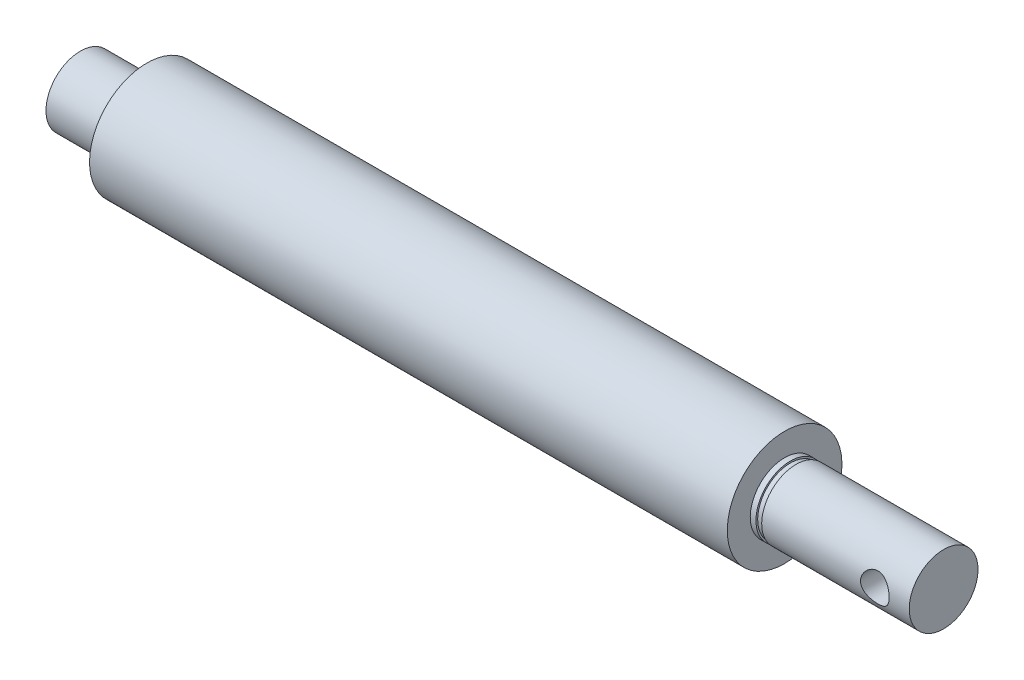
ISO-10303-21;
HEADER;
FILE_DESCRIPTION(('STEP AP214'),'2;1');
FILE_NAME('part.step','',(''),(''),'','','');
FILE_SCHEMA(('AUTOMOTIVE_DESIGN { 1 0 10303 214 1 1 1 1 }'));
ENDSEC;
DATA;
#1=APPLICATION_CONTEXT('core data for automotive mechanical design processes');
#2=APPLICATION_PROTOCOL_DEFINITION('international standard','automotive_design',2000,#1);
#3=PRODUCT_CONTEXT('',#1,'mechanical');
#4=PRODUCT('Part','Part','',(#3));
#5=PRODUCT_RELATED_PRODUCT_CATEGORY('part','',(#4));
#6=PRODUCT_DEFINITION_FORMATION('','',#4);
#7=PRODUCT_DEFINITION_CONTEXT('part definition',#1,'design');
#8=PRODUCT_DEFINITION('design','',#6,#7);
#9=PRODUCT_DEFINITION_SHAPE('','',#8);
#10=(LENGTH_UNIT() NAMED_UNIT(*) SI_UNIT(.MILLI.,.METRE.));
#11=(NAMED_UNIT(*) PLANE_ANGLE_UNIT() SI_UNIT($,.RADIAN.));
#12=(NAMED_UNIT(*) SI_UNIT($,.STERADIAN.) SOLID_ANGLE_UNIT());
#13=UNCERTAINTY_MEASURE_WITH_UNIT(LENGTH_MEASURE(1.E-05),#10,'distance_accuracy_value','');
#14=(GEOMETRIC_REPRESENTATION_CONTEXT(3) GLOBAL_UNCERTAINTY_ASSIGNED_CONTEXT((#13)) GLOBAL_UNIT_ASSIGNED_CONTEXT((#10,
#11,#12)) REPRESENTATION_CONTEXT('',''));
#15=CARTESIAN_POINT('',(0.,0.,0.));
#16=DIRECTION('',(0.,0.,1.));
#17=DIRECTION('',(1.,0.,0.));
#18=AXIS2_PLACEMENT_3D('',#15,#16,#17);
#19=CARTESIAN_POINT('',(0.,3.,0.));
#20=DIRECTION('',(1.,0.,0.));
#21=DIRECTION('',(0.,1.,0.));
#22=AXIS2_PLACEMENT_3D('',#19,#20,#21);
#23=PLANE('',#22);
#24=CARTESIAN_POINT('',(0.,0.,0.));
#25=DIRECTION('',(-1.,0.,0.));
#26=DIRECTION('',(0.,-1.,0.));
#27=AXIS2_PLACEMENT_3D('',#24,#25,#26);
#28=CIRCLE('',#27,3.);
#29=CARTESIAN_POINT('',(0.,-3.,0.));
#30=VERTEX_POINT('',#29);
#31=EDGE_CURVE('E135',#30,#30,#28,.T.);
#32=ORIENTED_EDGE('',*,*,#31,.T.);
#33=EDGE_LOOP('',(#32));
#34=FACE_BOUND('',#33,.T.);
#35=ADVANCED_FACE('F42',(#34),#23,.F.);
#36=CARTESIAN_POINT('',(75.3,0.,0.));
#37=DIRECTION('',(-1.,0.,0.));
#38=DIRECTION('',(0.,-1.,0.));
#39=AXIS2_PLACEMENT_3D('',#36,#37,#38);
#40=PLANE('',#39);
#41=CARTESIAN_POINT('',(75.3,0.,0.));
#42=DIRECTION('',(-1.,0.,0.));
#43=DIRECTION('',(0.,-1.,0.));
#44=AXIS2_PLACEMENT_3D('',#41,#42,#43);
#45=CIRCLE('',#44,3.00000000000001);
#46=CARTESIAN_POINT('',(75.3,-2.99999999999999,0.));
#47=VERTEX_POINT('',#46);
#48=EDGE_CURVE('E12',#47,#47,#45,.T.);
#49=ORIENTED_EDGE('',*,*,#48,.F.);
#50=EDGE_LOOP('',(#49));
#51=FACE_BOUND('',#50,.T.);
#52=ADVANCED_FACE('F123',(#51),#40,.F.);
#53=CARTESIAN_POINT('',(0.,0.,0.));
#54=DIRECTION('',(-1.,0.,0.));
#55=DIRECTION('',(0.,-1.,0.));
#56=AXIS2_PLACEMENT_3D('',#53,#54,#55);
#57=CYLINDRICAL_SURFACE('',#56,3.00000000000001);
#58=CARTESIAN_POINT('',(71.05,0.,3.00000000000001));
#59=CARTESIAN_POINT('',(71.0500072050913,0.0669580526362662,2.99999458367274));
#60=CARTESIAN_POINT('',(71.0554119585281,0.134021397063839,2.99773232974711));
#61=CARTESIAN_POINT('',(71.0768390649202,0.266247371156346,2.98890153579553));
#62=CARTESIAN_POINT('',(71.0928891244642,0.331404576423564,2.98232175901029));
#63=CARTESIAN_POINT('',(71.1349110917806,0.457688733653085,2.96556289038128));
#64=CARTESIAN_POINT('',(71.1608493894681,0.518828524426263,2.95539599975005));
#65=CARTESIAN_POINT('',(71.2217728232326,0.635829756679795,2.93245286470665));
#66=CARTESIAN_POINT('',(71.2567552189709,0.691692790015935,2.9196774109285));
#67=CARTESIAN_POINT('',(71.3366289825909,0.79944840355951,2.8920782835187));
#68=CARTESIAN_POINT('',(71.3819013087897,0.851041267517767,2.87718753326094));
#69=CARTESIAN_POINT('',(71.4802643347826,0.94615982109126,2.84732714068515));
#70=CARTESIAN_POINT('',(71.5333591248945,0.989681263153082,2.83235746106811));
#71=CARTESIAN_POINT('',(71.6490267775649,1.06953737697065,2.80321021812997));
#72=CARTESIAN_POINT('',(71.7119374484265,1.10541308153925,2.78910786873386));
#73=CARTESIAN_POINT('',(71.8435732579209,1.16593940588865,2.76435572357007));
#74=CARTESIAN_POINT('',(71.9122953794844,1.1905958083629,2.75370415000825));
#75=CARTESIAN_POINT('',(72.0501536917679,1.22674598312158,2.73778555387707));
#76=CARTESIAN_POINT('',(72.1191104833921,1.23881657877605,2.73228387651789));
#77=CARTESIAN_POINT('',(72.2582732926866,1.25125209967796,2.72661326219506));
#78=CARTESIAN_POINT('',(72.3284786000257,1.25162348054397,2.72644138425261));
#79=CARTESIAN_POINT('',(72.4624000604349,1.24108450363674,2.73125119560854));
#80=CARTESIAN_POINT('',(72.5262010965645,1.231036811123,2.73583882723625));
#81=CARTESIAN_POINT('',(72.6511120910004,1.20139191015776,2.74898482773798));
#82=CARTESIAN_POINT('',(72.7122215314918,1.18179287287176,2.75754395703565));
#83=CARTESIAN_POINT('',(72.8315577029914,1.13321958727571,2.77786184772758));
#84=CARTESIAN_POINT('',(72.8896954209134,1.10405471539236,2.78968481949138));
#85=CARTESIAN_POINT('',(73.0004777338801,1.03731242580562,2.81518331141087));
#86=CARTESIAN_POINT('',(73.0531201506135,0.999731690519542,2.82885956129781));
#87=CARTESIAN_POINT('',(73.1560999587328,0.913495965543835,2.85792976877981));
#88=CARTESIAN_POINT('',(73.2058665673854,0.864173483207527,2.87337121404474));
#89=CARTESIAN_POINT('',(73.2966135029592,0.757729591051513,2.90325673112531));
#90=CARTESIAN_POINT('',(73.3375917716922,0.700606359448457,2.91770056877011));
#91=CARTESIAN_POINT('',(73.4104358236163,0.578447948693374,2.94438283556474));
#92=CARTESIAN_POINT('',(73.4420694451507,0.513260582447676,2.95656266543335));
#93=CARTESIAN_POINT('',(73.4937211396033,0.377852402526825,2.97689481414804));
#94=CARTESIAN_POINT('',(73.5137456319438,0.307634394795027,2.98504935845801));
#95=CARTESIAN_POINT('',(73.5404159921266,0.16892811334622,2.99599641186386));
#96=CARTESIAN_POINT('',(73.5478278574437,0.100611285278633,2.99909541047126));
#97=CARTESIAN_POINT('',(73.5513462236141,-0.0363546554960932,3.00056050368746));
#98=CARTESIAN_POINT('',(73.547455970252,-0.105003667152638,2.9989279571194));
#99=CARTESIAN_POINT('',(73.5290289151939,-0.237098242341437,2.99131217656941));
#100=CARTESIAN_POINT('',(73.5150300459028,-0.300632966639388,2.9855488728399));
#101=CARTESIAN_POINT('',(73.4775318054592,-0.424382748971092,2.97048606772415));
#102=CARTESIAN_POINT('',(73.4540312340497,-0.484597386518362,2.96118611959704));
#103=CARTESIAN_POINT('',(73.3974290242879,-0.602108999869134,2.93958270645166));
#104=CARTESIAN_POINT('',(73.364051816854,-0.65925723685532,2.92719491469282));
#105=CARTESIAN_POINT('',(73.2889466222083,-0.767346216231424,2.90073804579091));
#106=CARTESIAN_POINT('',(73.2472151484707,-0.818284352601936,2.88666826768733));
#107=CARTESIAN_POINT('',(73.1530967667276,-0.916333430274259,2.85712087895438));
#108=CARTESIAN_POINT('',(73.1001614970137,-0.962910697979832,2.84161451591029));
#109=CARTESIAN_POINT('',(72.9869787240646,-1.04666984610551,2.81184336768005));
#110=CARTESIAN_POINT('',(72.9267295648283,-1.08384959285617,2.79757886493439));
#111=CARTESIAN_POINT('',(72.7993858246974,-1.14815960208699,2.77181386243988));
#112=CARTESIAN_POINT('',(72.7322059644851,-1.17513918237329,2.76035562555112));
#113=CARTESIAN_POINT('',(72.5936294061899,-1.21717413951573,2.74208355658957));
#114=CARTESIAN_POINT('',(72.5222362375166,-1.23223934863687,2.73526589555752));
#115=CARTESIAN_POINT('',(72.3831813008008,-1.24904080348901,2.72763164537264));
#116=CARTESIAN_POINT('',(72.3156553377074,-1.25171380413129,2.72639350967163));
#117=CARTESIAN_POINT('',(72.1811571388589,-1.24615575523912,2.72893853011024));
#118=CARTESIAN_POINT('',(72.1141848196863,-1.23792637964721,2.73272091540307));
#119=CARTESIAN_POINT('',(71.9859072525311,-1.21158404780491,2.74449551302268));
#120=CARTESIAN_POINT('',(71.9244833265366,-1.19394903571466,2.75228354846481));
#121=CARTESIAN_POINT('',(71.8054519786428,-1.14976328202134,2.77103181199189));
#122=CARTESIAN_POINT('',(71.7478456346012,-1.12321003517251,2.78199293131694));
#123=CARTESIAN_POINT('',(71.6343041040509,-1.06010285935489,2.80666954560014));
#124=CARTESIAN_POINT('',(71.5786776698317,-1.02304360910482,2.8205110271368));
#125=CARTESIAN_POINT('',(71.4741398606393,-0.940684072630383,2.8490368905384));
#126=CARTESIAN_POINT('',(71.4252308243994,-0.895380928905613,2.86372156345875));
#127=CARTESIAN_POINT('',(71.3318513183152,-0.793902045778817,2.89356392850107));
#128=CARTESIAN_POINT('',(71.2879635671593,-0.737174739949023,2.90867817511792));
#129=CARTESIAN_POINT('',(71.2103005464564,-0.616600079253196,2.93660143622021));
#130=CARTESIAN_POINT('',(71.1765298851104,-0.552749497945745,2.94940939916741));
#131=CARTESIAN_POINT('',(71.1207901545601,-0.420732056717952,2.97109183362461));
#132=CARTESIAN_POINT('',(71.0986352333827,-0.352653990980636,2.98002782581964));
#133=CARTESIAN_POINT('',(71.0662936709221,-0.213410421846556,2.99321009768625));
#134=CARTESIAN_POINT('',(71.0560695574701,-0.142255316980952,2.99747105811967));
#135=CARTESIAN_POINT('',(71.0506668389135,-0.047236081919179,2.99972287568934));
#136=CARTESIAN_POINT('',(71.0499974578508,-0.0236245946756549,3.00000191102537));
#137=CARTESIAN_POINT('',(71.05,0.,3.00000000000001));
#138=B_SPLINE_CURVE_WITH_KNOTS('',3,(#58,#59,#60,#61,#62,#63,#64,#65,#66,#67,#68,#69,#70,#71,
#72,#73,#74,#75,#76,#77,#78,#79,#80,#81,#82,#83,#84,#85,#86,#87,#88,#89,#90,#91,#92,#93,#94,#95,
#96,#97,#98,#99,#100,#101,#102,#103,#104,#105,#106,#107,#108,#109,#110,#111,#112,#113,#114,#115,
#116,#117,#118,#119,#120,#121,#122,#123,#124,#125,#126,#127,#128,#129,#130,#131,#132,#133,#134,
#135,#136,#137),.UNSPECIFIED.,.T.,.F.,(4,2,2,2,2,2,2,2,2,2,2,2,2,2,2,2,2,2,2,2,2,2,2,2,2,2,2,2,
2,2,2,2,2,2,2,2,2,2,2,4),(0.,0.200806918883938,0.402138540628695,0.602791851906291,
0.803384436852974,1.01317936288807,1.22308438131465,1.44331724539124,1.66343646730587,
1.87295273137556,2.08235338249046,2.27570157202557,2.46908679727213,2.66658713058715,
2.86416545717206,3.07844141127895,3.29276749314588,3.51204055060813,3.73119224218297,
3.93648443393251,4.14171767493171,4.33676589735721,4.53183876601785,4.7329713527216,
4.93418805469496,5.14978488029293,5.36543061240341,5.58414788359523,5.8026844707458,
6.00439877559643,6.20608211297537,6.39837649964763,6.59072494950613,6.79463893397441,
6.99862373425943,7.21746535004889,7.43640649428582,7.65172855819385,7.86637250469321,
7.93722256499097),.UNSPECIFIED.);
#139=CARTESIAN_POINT('',(71.05,0.,3.00000000000001));
#140=VERTEX_POINT('',#139);
#141=EDGE_CURVE('E45',#140,#140,#138,.T.);
#142=ORIENTED_EDGE('',*,*,#141,.T.);
#143=EDGE_LOOP('',(#142));
#144=FACE_BOUND('',#143,.T.);
#145=CARTESIAN_POINT('',(71.05,0.,-3.00000000000001));
#146=CARTESIAN_POINT('',(71.0500072050913,-0.0669580526362663,-2.99999458367273));
#147=CARTESIAN_POINT('',(71.0554119585281,-0.13402139706384,-2.99773232974711));
#148=CARTESIAN_POINT('',(71.0768390649202,-0.266247371156346,-2.98890153579552));
#149=CARTESIAN_POINT('',(71.0928891244642,-0.331404576423566,-2.98232175901028));
#150=CARTESIAN_POINT('',(71.1349110917806,-0.45768873365309,-2.96556289038128));
#151=CARTESIAN_POINT('',(71.1608493894682,-0.51882852442627,-2.95539599975004));
#152=CARTESIAN_POINT('',(71.2217728232326,-0.635829756679802,-2.93245286470664));
#153=CARTESIAN_POINT('',(71.2567552189709,-0.691692790015939,-2.9196774109285));
#154=CARTESIAN_POINT('',(71.3366289825909,-0.799448403559511,-2.89207828351869));
#155=CARTESIAN_POINT('',(71.3819013087897,-0.851041267517768,-2.87718753326093));
#156=CARTESIAN_POINT('',(71.4802643347826,-0.94615982109126,-2.84732714068514));
#157=CARTESIAN_POINT('',(71.5333591248945,-0.989681263153082,-2.8323574610681));
#158=CARTESIAN_POINT('',(71.6490267775649,-1.06953737697065,-2.80321021812995));
#159=CARTESIAN_POINT('',(71.7119374484265,-1.10541308153925,-2.78910786873385));
#160=CARTESIAN_POINT('',(71.8435732579209,-1.16593940588865,-2.76435572357005));
#161=CARTESIAN_POINT('',(71.9122953794844,-1.1905958083629,-2.75370415000824));
#162=CARTESIAN_POINT('',(72.0501536917679,-1.22674598312158,-2.73778555387705));
#163=CARTESIAN_POINT('',(72.1191104833921,-1.23881657877605,-2.73228387651787));
#164=CARTESIAN_POINT('',(72.2582732926866,-1.25125209967796,-2.72661326219504));
#165=CARTESIAN_POINT('',(72.3284786000257,-1.25162348054397,-2.7264413842526));
#166=CARTESIAN_POINT('',(72.4624000604349,-1.24108450363674,-2.73125119560853));
#167=CARTESIAN_POINT('',(72.5262010965645,-1.231036811123,-2.73583882723623));
#168=CARTESIAN_POINT('',(72.6511120910004,-1.20139191015776,-2.74898482773797));
#169=CARTESIAN_POINT('',(72.7122215314918,-1.18179287287176,-2.75754395703564));
#170=CARTESIAN_POINT('',(72.8315577029914,-1.13321958727571,-2.77786184772757));
#171=CARTESIAN_POINT('',(72.8896954209134,-1.10405471539236,-2.78968481949137));
#172=CARTESIAN_POINT('',(73.0004777338801,-1.03731242580562,-2.81518331141086));
#173=CARTESIAN_POINT('',(73.0531201506135,-0.999731690519542,-2.8288595612978));
#174=CARTESIAN_POINT('',(73.1560999587328,-0.913495965543835,-2.8579297687798));
#175=CARTESIAN_POINT('',(73.2058665673854,-0.864173483207527,-2.87337121404473));
#176=CARTESIAN_POINT('',(73.2966135029592,-0.757729591051513,-2.9032567311253));
#177=CARTESIAN_POINT('',(73.3375917716922,-0.700606359448457,-2.9177005687701));
#178=CARTESIAN_POINT('',(73.4104358236163,-0.578447948693374,-2.94438283556473));
#179=CARTESIAN_POINT('',(73.4420694451507,-0.513260582447676,-2.95656266543334));
#180=CARTESIAN_POINT('',(73.4937211396033,-0.377852402526825,-2.97689481414804));
#181=CARTESIAN_POINT('',(73.5137456319438,-0.307634394795028,-2.98504935845801));
#182=CARTESIAN_POINT('',(73.5404159921266,-0.168928113346221,-2.99599641186386));
#183=CARTESIAN_POINT('',(73.5478278574437,-0.100611285278633,-2.99909541047126));
#184=CARTESIAN_POINT('',(73.5513462236141,0.036354655496093,-3.00056050368746));
#185=CARTESIAN_POINT('',(73.547455970252,0.105003667152638,-2.9989279571194));
#186=CARTESIAN_POINT('',(73.5290289151939,0.237098242341436,-2.99131217656941));
#187=CARTESIAN_POINT('',(73.5150300459028,0.300632966639388,-2.98554887283991));
#188=CARTESIAN_POINT('',(73.4775318054592,0.424382748971092,-2.97048606772415));
#189=CARTESIAN_POINT('',(73.4540312340497,0.484597386518362,-2.96118611959705));
#190=CARTESIAN_POINT('',(73.3974290242879,0.602108999869135,-2.93958270645167));
#191=CARTESIAN_POINT('',(73.364051816854,0.65925723685532,-2.92719491469283));
#192=CARTESIAN_POINT('',(73.2889466222083,0.767346216231424,-2.90073804579092));
#193=CARTESIAN_POINT('',(73.2472151484707,0.818284352601936,-2.88666826768734));
#194=CARTESIAN_POINT('',(73.1530967667276,0.916333430274259,-2.85712087895439));
#195=CARTESIAN_POINT('',(73.1001614970137,0.962910697979832,-2.84161451591031));
#196=CARTESIAN_POINT('',(72.9869787240646,1.04666984610551,-2.81184336768007));
#197=CARTESIAN_POINT('',(72.9267295648283,1.08384959285617,-2.7975788649344));
#198=CARTESIAN_POINT('',(72.7993858246974,1.14815960208699,-2.7718138624399));
#199=CARTESIAN_POINT('',(72.7322059644852,1.17513918237328,-2.76035562555113));
#200=CARTESIAN_POINT('',(72.5936294061899,1.21717413951572,-2.74208355658959));
#201=CARTESIAN_POINT('',(72.5222362375167,1.23223934863687,-2.73526589555754));
#202=CARTESIAN_POINT('',(72.3831813008008,1.249040803489,-2.72763164537266));
#203=CARTESIAN_POINT('',(72.3156553377074,1.25171380413129,-2.72639350967164));
#204=CARTESIAN_POINT('',(72.1811571388589,1.24615575523912,-2.72893853011026));
#205=CARTESIAN_POINT('',(72.1141848196863,1.23792637964721,-2.73272091540308));
#206=CARTESIAN_POINT('',(71.9859072525311,1.21158404780491,-2.7444955130227));
#207=CARTESIAN_POINT('',(71.9244833265366,1.19394903571466,-2.75228354846482));
#208=CARTESIAN_POINT('',(71.8054519786428,1.14976328202134,-2.77103181199191));
#209=CARTESIAN_POINT('',(71.7478456346012,1.12321003517251,-2.78199293131695));
#210=CARTESIAN_POINT('',(71.6343041040509,1.06010285935489,-2.80666954560015));
#211=CARTESIAN_POINT('',(71.5786776698317,1.02304360910483,-2.82051102713681));
#212=CARTESIAN_POINT('',(71.4741398606393,0.940684072630388,-2.84903689053841));
#213=CARTESIAN_POINT('',(71.4252308243994,0.895380928905615,-2.86372156345876));
#214=CARTESIAN_POINT('',(71.3318513183152,0.793902045778817,-2.89356392850108));
#215=CARTESIAN_POINT('',(71.2879635671593,0.737174739949026,-2.90867817511793));
#216=CARTESIAN_POINT('',(71.2103005464564,0.616600079253198,-2.93660143622021));
#217=CARTESIAN_POINT('',(71.1765298851104,0.552749497945743,-2.94940939916742));
#218=CARTESIAN_POINT('',(71.1207901545601,0.420732056717946,-2.97109183362462));
#219=CARTESIAN_POINT('',(71.0986352333827,0.352653990980632,-2.98002782581965));
#220=CARTESIAN_POINT('',(71.0662936709221,0.213410421846553,-2.99321009768626));
#221=CARTESIAN_POINT('',(71.0560695574701,0.14225531698095,-2.99747105811968));
#222=CARTESIAN_POINT('',(71.0506668389135,0.0472360819191778,-2.99972287568934));
#223=CARTESIAN_POINT('',(71.0499974578508,0.0236245946756543,-3.00000191102537));
#224=CARTESIAN_POINT('',(71.05,0.,-3.00000000000001));
#225=B_SPLINE_CURVE_WITH_KNOTS('',3,(#145,#146,#147,#148,#149,#150,#151,#152,#153,#154,#155,
#156,#157,#158,#159,#160,#161,#162,#163,#164,#165,#166,#167,#168,#169,#170,#171,#172,#173,#174,
#175,#176,#177,#178,#179,#180,#181,#182,#183,#184,#185,#186,#187,#188,#189,#190,#191,#192,#193,
#194,#195,#196,#197,#198,#199,#200,#201,#202,#203,#204,#205,#206,#207,#208,#209,#210,#211,#212,
#213,#214,#215,#216,#217,#218,#219,#220,#221,#222,#223,#224),.UNSPECIFIED.,.T.,.F.,(4,2,2,2,2,2,
2,2,2,2,2,2,2,2,2,2,2,2,2,2,2,2,2,2,2,2,2,2,2,2,2,2,2,2,2,2,2,2,2,4),(0.,0.200806918883938,
0.402138540628696,0.602791851906308,0.803384436852975,1.01317936288807,1.22308438131465,
1.44331724539124,1.66343646730587,1.87295273137556,2.08235338249046,2.27570157202557,
2.46908679727213,2.66658713058715,2.86416545717206,3.07844141127896,3.29276749314588,
3.51204055060814,3.73119224218298,3.93648443393251,4.14171767493172,4.33676589735721,
4.53183876601785,4.7329713527216,4.93418805469496,5.14978488029293,5.36543061240341,
5.58414788359522,5.80268447074579,6.00439877559643,6.20608211297537,6.39837649964762,
6.59072494950613,6.79463893397441,6.99862373425944,7.21746535004889,7.43640649428582,
7.65172855819385,7.86637250469321,7.93722256499097),.UNSPECIFIED.);
#226=CARTESIAN_POINT('',(71.05,0.,-3.00000000000001));
#227=VERTEX_POINT('',#226);
#228=EDGE_CURVE('E61',#227,#227,#225,.T.);
#229=ORIENTED_EDGE('',*,*,#228,.T.);
#230=EDGE_LOOP('',(#229));
#231=FACE_BOUND('',#230,.T.);
#232=CARTESIAN_POINT('',(62.43,0.,0.));
#233=DIRECTION('',(-1.,0.,0.));
#234=DIRECTION('',(0.,-1.,0.));
#235=AXIS2_PLACEMENT_3D('',#232,#233,#234);
#236=CIRCLE('',#235,3.00000000000001);
#237=CARTESIAN_POINT('',(62.43,-2.99999999999999,0.));
#238=VERTEX_POINT('',#237);
#239=EDGE_CURVE('E53',#238,#238,#236,.T.);
#240=ORIENTED_EDGE('',*,*,#239,.F.);
#241=EDGE_LOOP('',(#240));
#242=FACE_BOUND('',#241,.T.);
#243=ORIENTED_EDGE('',*,*,#48,.T.);
#244=EDGE_LOOP('',(#243));
#245=FACE_BOUND('',#244,.T.);
#246=ADVANCED_FACE('F65',(#144,#231,#242,#245),#57,.T.);
#247=CARTESIAN_POINT('',(62.43,3.00000000000002,0.));
#248=DIRECTION('',(1.,0.,0.));
#249=DIRECTION('',(0.,1.,0.));
#250=AXIS2_PLACEMENT_3D('',#247,#248,#249);
#251=PLANE('',#250);
#252=CARTESIAN_POINT('',(62.43,0.,0.));
#253=DIRECTION('',(-1.,0.,0.));
#254=DIRECTION('',(0.,-1.,0.));
#255=AXIS2_PLACEMENT_3D('',#252,#253,#254);
#256=CIRCLE('',#255,2.85000000000001);
#257=CARTESIAN_POINT('',(62.43,-2.84999999999999,0.));
#258=VERTEX_POINT('',#257);
#259=EDGE_CURVE('E58',#258,#258,#256,.T.);
#260=ORIENTED_EDGE('',*,*,#259,.F.);
#261=EDGE_LOOP('',(#260));
#262=FACE_BOUND('',#261,.T.);
#263=ORIENTED_EDGE('',*,*,#239,.T.);
#264=EDGE_LOOP('',(#263));
#265=FACE_BOUND('',#264,.T.);
#266=ADVANCED_FACE('F116',(#262,#265),#251,.F.);
#267=CARTESIAN_POINT('',(0.,0.,0.));
#268=DIRECTION('',(-1.,0.,0.));
#269=DIRECTION('',(0.,-1.,0.));
#270=AXIS2_PLACEMENT_3D('',#267,#268,#269);
#271=CYLINDRICAL_SURFACE('',#270,2.85000000000001);
#272=CARTESIAN_POINT('',(61.93,0.,0.));
#273=DIRECTION('',(-1.,0.,0.));
#274=DIRECTION('',(0.,-1.,0.));
#275=AXIS2_PLACEMENT_3D('',#272,#273,#274);
#276=CIRCLE('',#275,2.85000000000001);
#277=CARTESIAN_POINT('',(61.93,-2.84999999999999,0.));
#278=VERTEX_POINT('',#277);
#279=EDGE_CURVE('E166',#278,#278,#276,.T.);
#280=ORIENTED_EDGE('',*,*,#279,.F.);
#281=EDGE_LOOP('',(#280));
#282=FACE_BOUND('',#281,.T.);
#283=ORIENTED_EDGE('',*,*,#259,.T.);
#284=EDGE_LOOP('',(#283));
#285=FACE_BOUND('',#284,.T.);
#286=ADVANCED_FACE('F113',(#282,#285),#271,.T.);
#287=CARTESIAN_POINT('',(61.93,2.85000000000002,0.));
#288=DIRECTION('',(-1.,0.,0.));
#289=DIRECTION('',(0.,-1.,0.));
#290=AXIS2_PLACEMENT_3D('',#287,#288,#289);
#291=PLANE('',#290);
#292=CARTESIAN_POINT('',(61.93,0.,0.));
#293=DIRECTION('',(-1.,0.,0.));
#294=DIRECTION('',(0.,-1.,0.));
#295=AXIS2_PLACEMENT_3D('',#292,#293,#294);
#296=CIRCLE('',#295,3.00000000000001);
#297=CARTESIAN_POINT('',(61.93,-2.99999999999999,0.));
#298=VERTEX_POINT('',#297);
#299=EDGE_CURVE('E163',#298,#298,#296,.T.);
#300=ORIENTED_EDGE('',*,*,#299,.F.);
#301=EDGE_LOOP('',(#300));
#302=FACE_BOUND('',#301,.T.);
#303=ORIENTED_EDGE('',*,*,#279,.T.);
#304=EDGE_LOOP('',(#303));
#305=FACE_BOUND('',#304,.T.);
#306=ADVANCED_FACE('F109',(#302,#305),#291,.F.);
#307=CARTESIAN_POINT('',(0.,0.,0.));
#308=DIRECTION('',(-1.,0.,0.));
#309=DIRECTION('',(0.,-1.,0.));
#310=AXIS2_PLACEMENT_3D('',#307,#308,#309);
#311=CYLINDRICAL_SURFACE('',#310,3.00000000000001);
#312=CARTESIAN_POINT('',(61.43,0.,0.));
#313=DIRECTION('',(-1.,0.,0.));
#314=DIRECTION('',(0.,-1.,0.));
#315=AXIS2_PLACEMENT_3D('',#312,#313,#314);
#316=CIRCLE('',#315,3.00000000000001);
#317=CARTESIAN_POINT('',(61.43,-2.99999999999999,0.));
#318=VERTEX_POINT('',#317);
#319=EDGE_CURVE('E160',#318,#318,#316,.T.);
#320=ORIENTED_EDGE('',*,*,#319,.F.);
#321=EDGE_LOOP('',(#320));
#322=FACE_BOUND('',#321,.T.);
#323=ORIENTED_EDGE('',*,*,#299,.T.);
#324=EDGE_LOOP('',(#323));
#325=FACE_BOUND('',#324,.T.);
#326=ADVANCED_FACE('F105',(#322,#325),#311,.T.);
#327=CARTESIAN_POINT('',(61.43,3.00000000000002,0.));
#328=DIRECTION('',(-1.,0.,0.));
#329=DIRECTION('',(0.,-1.,0.));
#330=AXIS2_PLACEMENT_3D('',#327,#328,#329);
#331=PLANE('',#330);
#332=CARTESIAN_POINT('',(61.43,0.,0.));
#333=DIRECTION('',(-1.,0.,0.));
#334=DIRECTION('',(0.,-1.,0.));
#335=AXIS2_PLACEMENT_3D('',#332,#333,#334);
#336=CIRCLE('',#335,4.99999999999999);
#337=CARTESIAN_POINT('',(61.43,-4.99999999999998,0.));
#338=VERTEX_POINT('',#337);
#339=EDGE_CURVE('E157',#338,#338,#336,.T.);
#340=ORIENTED_EDGE('',*,*,#339,.F.);
#341=EDGE_LOOP('',(#340));
#342=FACE_BOUND('',#341,.T.);
#343=ORIENTED_EDGE('',*,*,#319,.T.);
#344=EDGE_LOOP('',(#343));
#345=FACE_BOUND('',#344,.T.);
#346=ADVANCED_FACE('F101',(#342,#345),#331,.F.);
#347=CARTESIAN_POINT('',(0.,0.,0.));
#348=DIRECTION('',(-1.,0.,0.));
#349=DIRECTION('',(0.,-1.,0.));
#350=AXIS2_PLACEMENT_3D('',#347,#348,#349);
#351=CYLINDRICAL_SURFACE('',#350,5.);
#352=CARTESIAN_POINT('',(5.8,0.,0.));
#353=DIRECTION('',(-1.,0.,0.));
#354=DIRECTION('',(0.,-1.,0.));
#355=AXIS2_PLACEMENT_3D('',#352,#353,#354);
#356=CIRCLE('',#355,5.);
#357=CARTESIAN_POINT('',(5.8,-5.,0.));
#358=VERTEX_POINT('',#357);
#359=EDGE_CURVE('E154',#358,#358,#356,.T.);
#360=ORIENTED_EDGE('',*,*,#359,.F.);
#361=EDGE_LOOP('',(#360));
#362=FACE_BOUND('',#361,.T.);
#363=ORIENTED_EDGE('',*,*,#339,.T.);
#364=EDGE_LOOP('',(#363));
#365=FACE_BOUND('',#364,.T.);
#366=ADVANCED_FACE('F97',(#362,#365),#351,.T.);
#367=CARTESIAN_POINT('',(5.8,5.,0.));
#368=DIRECTION('',(1.,0.,0.));
#369=DIRECTION('',(0.,1.,0.));
#370=AXIS2_PLACEMENT_3D('',#367,#368,#369);
#371=PLANE('',#370);
#372=CARTESIAN_POINT('',(5.8,0.,0.));
#373=DIRECTION('',(-1.,0.,0.));
#374=DIRECTION('',(0.,-1.,0.));
#375=AXIS2_PLACEMENT_3D('',#372,#373,#374);
#376=CIRCLE('',#375,3.);
#377=CARTESIAN_POINT('',(5.8,-3.,0.));
#378=VERTEX_POINT('',#377);
#379=EDGE_CURVE('E151',#378,#378,#376,.T.);
#380=ORIENTED_EDGE('',*,*,#379,.F.);
#381=EDGE_LOOP('',(#380));
#382=FACE_BOUND('',#381,.T.);
#383=ORIENTED_EDGE('',*,*,#359,.T.);
#384=EDGE_LOOP('',(#383));
#385=FACE_BOUND('',#384,.T.);
#386=ADVANCED_FACE('F93',(#382,#385),#371,.F.);
#387=CARTESIAN_POINT('',(0.,0.,0.));
#388=DIRECTION('',(-1.,0.,0.));
#389=DIRECTION('',(0.,-1.,0.));
#390=AXIS2_PLACEMENT_3D('',#387,#388,#389);
#391=CYLINDRICAL_SURFACE('',#390,3.);
#392=CARTESIAN_POINT('',(5.3,0.,0.));
#393=DIRECTION('',(-1.,0.,0.));
#394=DIRECTION('',(0.,-1.,0.));
#395=AXIS2_PLACEMENT_3D('',#392,#393,#394);
#396=CIRCLE('',#395,3.);
#397=CARTESIAN_POINT('',(5.3,-3.,0.));
#398=VERTEX_POINT('',#397);
#399=EDGE_CURVE('E148',#398,#398,#396,.T.);
#400=ORIENTED_EDGE('',*,*,#399,.F.);
#401=EDGE_LOOP('',(#400));
#402=FACE_BOUND('',#401,.T.);
#403=ORIENTED_EDGE('',*,*,#379,.T.);
#404=EDGE_LOOP('',(#403));
#405=FACE_BOUND('',#404,.T.);
#406=ADVANCED_FACE('F89',(#402,#405),#391,.T.);
#407=CARTESIAN_POINT('',(5.3,3.,0.));
#408=DIRECTION('',(1.,0.,0.));
#409=DIRECTION('',(0.,1.,0.));
#410=AXIS2_PLACEMENT_3D('',#407,#408,#409);
#411=PLANE('',#410);
#412=CARTESIAN_POINT('',(5.30000000000001,0.,0.));
#413=DIRECTION('',(-1.,0.,0.));
#414=DIRECTION('',(0.,-1.,0.));
#415=AXIS2_PLACEMENT_3D('',#412,#413,#414);
#416=CIRCLE('',#415,2.85000000000001);
#417=CARTESIAN_POINT('',(5.30000000000001,-2.85000000000001,0.));
#418=VERTEX_POINT('',#417);
#419=EDGE_CURVE('E145',#418,#418,#416,.T.);
#420=ORIENTED_EDGE('',*,*,#419,.F.);
#421=EDGE_LOOP('',(#420));
#422=FACE_BOUND('',#421,.T.);
#423=ORIENTED_EDGE('',*,*,#399,.T.);
#424=EDGE_LOOP('',(#423));
#425=FACE_BOUND('',#424,.T.);
#426=ADVANCED_FACE('F85',(#422,#425),#411,.F.);
#427=CARTESIAN_POINT('',(0.,0.,0.));
#428=DIRECTION('',(-1.,0.,0.));
#429=DIRECTION('',(0.,-1.,0.));
#430=AXIS2_PLACEMENT_3D('',#427,#428,#429);
#431=CYLINDRICAL_SURFACE('',#430,2.85000000000001);
#432=CARTESIAN_POINT('',(4.80000000000001,0.,0.));
#433=DIRECTION('',(-1.,0.,0.));
#434=DIRECTION('',(0.,-1.,0.));
#435=AXIS2_PLACEMENT_3D('',#432,#433,#434);
#436=CIRCLE('',#435,2.85000000000001);
#437=CARTESIAN_POINT('',(4.80000000000001,-2.85000000000001,0.));
#438=VERTEX_POINT('',#437);
#439=EDGE_CURVE('E139',#438,#438,#436,.T.);
#440=ORIENTED_EDGE('',*,*,#439,.F.);
#441=EDGE_LOOP('',(#440));
#442=FACE_BOUND('',#441,.T.);
#443=ORIENTED_EDGE('',*,*,#419,.T.);
#444=EDGE_LOOP('',(#443));
#445=FACE_BOUND('',#444,.T.);
#446=ADVANCED_FACE('F81',(#442,#445),#431,.T.);
#447=CARTESIAN_POINT('',(4.8,2.85000000000002,0.));
#448=DIRECTION('',(-1.,0.,0.));
#449=DIRECTION('',(0.,-1.,0.));
#450=AXIS2_PLACEMENT_3D('',#447,#448,#449);
#451=PLANE('',#450);
#452=CARTESIAN_POINT('',(4.8,0.,0.));
#453=DIRECTION('',(-1.,0.,0.));
#454=DIRECTION('',(0.,-1.,0.));
#455=AXIS2_PLACEMENT_3D('',#452,#453,#454);
#456=CIRCLE('',#455,3.);
#457=CARTESIAN_POINT('',(4.8,-3.,0.));
#458=VERTEX_POINT('',#457);
#459=EDGE_CURVE('E136',#458,#458,#456,.T.);
#460=ORIENTED_EDGE('',*,*,#459,.F.);
#461=EDGE_LOOP('',(#460));
#462=FACE_BOUND('',#461,.T.);
#463=ORIENTED_EDGE('',*,*,#439,.T.);
#464=EDGE_LOOP('',(#463));
#465=FACE_BOUND('',#464,.T.);
#466=ADVANCED_FACE('F77',(#462,#465),#451,.F.);
#467=CARTESIAN_POINT('',(0.,0.,0.));
#468=DIRECTION('',(-1.,0.,0.));
#469=DIRECTION('',(0.,-1.,0.));
#470=AXIS2_PLACEMENT_3D('',#467,#468,#469);
#471=CYLINDRICAL_SURFACE('',#470,3.);
#472=ORIENTED_EDGE('',*,*,#31,.F.);
#473=EDGE_LOOP('',(#472));
#474=FACE_BOUND('',#473,.T.);
#475=ORIENTED_EDGE('',*,*,#459,.T.);
#476=EDGE_LOOP('',(#475));
#477=FACE_BOUND('',#476,.T.);
#478=ADVANCED_FACE('F72',(#474,#477),#471,.T.);
#479=CARTESIAN_POINT('',(72.3,0.,5.));
#480=DIRECTION('',(0.,0.,-1.));
#481=DIRECTION('',(-1.,0.,0.));
#482=AXIS2_PLACEMENT_3D('',#479,#480,#481);
#483=CYLINDRICAL_SURFACE('',#482,1.25);
#484=ORIENTED_EDGE('',*,*,#228,.F.);
#485=EDGE_LOOP('',(#484));
#486=FACE_BOUND('',#485,.T.);
#487=ORIENTED_EDGE('',*,*,#141,.F.);
#488=EDGE_LOOP('',(#487));
#489=FACE_BOUND('',#488,.T.);
#490=ADVANCED_FACE('F68',(#486,#489),#483,.F.);
#491=CLOSED_SHELL('',(#35,#52,#246,#266,#286,#306,#326,#346,#366,#386,#406,#426,#446,#466,#478,#490));
#492=MANIFOLD_SOLID_BREP('B2',#491);
#493=ADVANCED_BREP_SHAPE_REPRESENTATION('',(#18,#492),#14);
#494=SHAPE_DEFINITION_REPRESENTATION(#9,#493);
ENDSEC;
END-ISO-10303-21;
